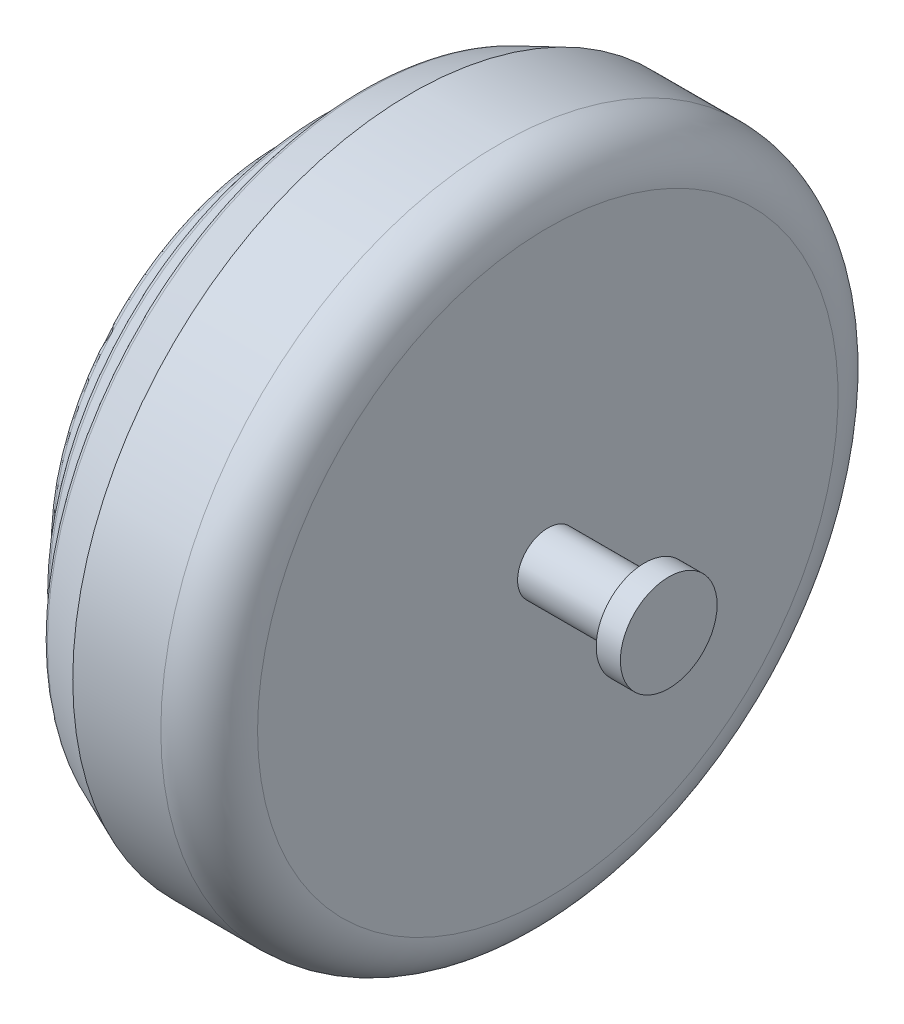
ISO-10303-21;
HEADER;
FILE_DESCRIPTION(('STEP AP214'),'2;1');
FILE_NAME('part.step','',(''),(''),'','','');
FILE_SCHEMA(('AUTOMOTIVE_DESIGN { 1 0 10303 214 1 1 1 1 }'));
ENDSEC;
DATA;
#1=APPLICATION_CONTEXT('core data for automotive mechanical design processes');
#2=APPLICATION_PROTOCOL_DEFINITION('international standard','automotive_design',2000,#1);
#3=PRODUCT_CONTEXT('',#1,'mechanical');
#4=PRODUCT('Part','Part','',(#3));
#5=PRODUCT_RELATED_PRODUCT_CATEGORY('part','',(#4));
#6=PRODUCT_DEFINITION_FORMATION('','',#4);
#7=PRODUCT_DEFINITION_CONTEXT('part definition',#1,'design');
#8=PRODUCT_DEFINITION('design','',#6,#7);
#9=PRODUCT_DEFINITION_SHAPE('','',#8);
#10=(LENGTH_UNIT() NAMED_UNIT(*) SI_UNIT(.MILLI.,.METRE.));
#11=(NAMED_UNIT(*) PLANE_ANGLE_UNIT() SI_UNIT($,.RADIAN.));
#12=(NAMED_UNIT(*) SI_UNIT($,.STERADIAN.) SOLID_ANGLE_UNIT());
#13=UNCERTAINTY_MEASURE_WITH_UNIT(LENGTH_MEASURE(1.E-05),#10,'distance_accuracy_value','');
#14=(GEOMETRIC_REPRESENTATION_CONTEXT(3) GLOBAL_UNCERTAINTY_ASSIGNED_CONTEXT((#13)) GLOBAL_UNIT_ASSIGNED_CONTEXT((#10,
#11,#12)) REPRESENTATION_CONTEXT('',''));
#15=CARTESIAN_POINT('',(0.,0.,0.));
#16=DIRECTION('',(0.,0.,1.));
#17=DIRECTION('',(1.,0.,0.));
#18=AXIS2_PLACEMENT_3D('',#15,#16,#17);
#19=CARTESIAN_POINT('',(126.445710742998,0.,0.));
#20=DIRECTION('',(1.,0.,0.));
#21=DIRECTION('',(0.,0.,-1.));
#22=AXIS2_PLACEMENT_3D('',#19,#20,#21);
#23=PLANE('',#22);
#24=CARTESIAN_POINT('',(126.445710742998,0.,0.));
#25=DIRECTION('',(1.,0.,0.));
#26=DIRECTION('',(0.,0.,-1.));
#27=AXIS2_PLACEMENT_3D('',#24,#25,#26);
#28=CIRCLE('',#27,12.5);
#29=CARTESIAN_POINT('',(126.445710742998,0.,-12.5));
#30=VERTEX_POINT('',#29);
#31=EDGE_CURVE('E99',#30,#30,#28,.T.);
#32=ORIENTED_EDGE('',*,*,#31,.F.);
#33=EDGE_LOOP('',(#32));
#34=FACE_BOUND('',#33,.T.);
#35=CARTESIAN_POINT('',(126.445710742998,0.,0.));
#36=DIRECTION('',(-1.,0.,0.));
#37=DIRECTION('',(0.,0.,1.));
#38=AXIS2_PLACEMENT_3D('',#35,#36,#37);
#39=CIRCLE('',#38,120.);
#40=CARTESIAN_POINT('',(126.445710742998,0.,120.));
#41=VERTEX_POINT('',#40);
#42=EDGE_CURVE('E95',#41,#41,#39,.T.);
#43=ORIENTED_EDGE('',*,*,#42,.F.);
#44=EDGE_LOOP('',(#43));
#45=FACE_BOUND('',#44,.T.);
#46=ADVANCED_FACE('F51',(#34,#45),#23,.T.);
#47=CARTESIAN_POINT('',(106.445710742998,0.,0.));
#48=DIRECTION('',(-1.,0.,0.));
#49=DIRECTION('',(0.,0.,1.));
#50=AXIS2_PLACEMENT_3D('',#47,#48,#49);
#51=TOROIDAL_SURFACE('',#50,120.,20.);
#52=ORIENTED_EDGE('',*,*,#42,.T.);
#53=EDGE_LOOP('',(#52));
#54=FACE_BOUND('',#53,.T.);
#55=CARTESIAN_POINT('',(106.445710742998,0.,0.));
#56=DIRECTION('',(-1.,0.,0.));
#57=DIRECTION('',(0.,0.,1.));
#58=AXIS2_PLACEMENT_3D('',#55,#56,#57);
#59=CIRCLE('',#58,140.);
#60=CARTESIAN_POINT('',(106.445710742998,0.,140.));
#61=VERTEX_POINT('',#60);
#62=EDGE_CURVE('E89',#61,#61,#59,.T.);
#63=ORIENTED_EDGE('',*,*,#62,.F.);
#64=EDGE_LOOP('',(#63));
#65=FACE_BOUND('',#64,.T.);
#66=ADVANCED_FACE('F142',(#54,#65),#51,.T.);
#67=CARTESIAN_POINT('',(15.,0.,0.));
#68=DIRECTION('',(1.,0.,0.));
#69=DIRECTION('',(0.,0.,-1.));
#70=AXIS2_PLACEMENT_3D('',#67,#68,#69);
#71=CONICAL_SURFACE('',#70,95.,0.402417517667305);
#72=CARTESIAN_POINT('',(18.0417805829536,0.,0.));
#73=DIRECTION('',(1.,0.,0.));
#74=DIRECTION('',(0.,0.,-1.));
#75=AXIS2_PLACEMENT_3D('',#72,#73,#74);
#76=CIRCLE('',#75,96.2947211260738);
#77=CARTESIAN_POINT('',(18.0417805829536,0.,-96.2947211260738));
#78=VERTEX_POINT('',#77);
#79=EDGE_CURVE('E80',#78,#78,#76,.T.);
#80=ORIENTED_EDGE('',*,*,#79,.T.);
#81=EDGE_LOOP('',(#80));
#82=FACE_BOUND('',#81,.T.);
#83=CARTESIAN_POINT('',(28.8270288411449,0.,0.));
#84=DIRECTION('',(1.,0.,0.));
#85=DIRECTION('',(0.,0.,-1.));
#86=AXIS2_PLACEMENT_3D('',#83,#84,#85);
#87=CIRCLE('',#86,100.88541673643);
#88=CARTESIAN_POINT('',(28.8270288411449,0.,-100.88541673643));
#89=VERTEX_POINT('',#88);
#90=EDGE_CURVE('E83',#89,#89,#87,.F.);
#91=ORIENTED_EDGE('',*,*,#90,.T.);
#92=EDGE_LOOP('',(#91));
#93=FACE_BOUND('',#92,.T.);
#94=ADVANCED_FACE('F131',(#82,#93),#71,.T.);
#95=CARTESIAN_POINT('',(15.,0.,0.));
#96=DIRECTION('',(1.,0.,0.));
#97=DIRECTION('',(0.,0.,-1.));
#98=AXIS2_PLACEMENT_3D('',#95,#96,#97);
#99=PLANE('',#98);
#100=CARTESIAN_POINT('',(15.,0.,0.));
#101=DIRECTION('',(1.,0.,0.));
#102=DIRECTION('',(0.,0.,-1.));
#103=AXIS2_PLACEMENT_3D('',#100,#101,#102);
#104=CIRCLE('',#103,91.6941367376833);
#105=CARTESIAN_POINT('',(15.,0.,-91.6941367376833));
#106=VERTEX_POINT('',#105);
#107=EDGE_CURVE('E86',#106,#106,#104,.F.);
#108=ORIENTED_EDGE('',*,*,#107,.T.);
#109=EDGE_LOOP('',(#108));
#110=FACE_BOUND('',#109,.T.);
#111=ADVANCED_FACE('F128',(#110),#99,.F.);
#112=CARTESIAN_POINT('',(31.8688094240985,0.,0.));
#113=DIRECTION('',(-1.,0.,0.));
#114=DIRECTION('',(0.,0.,1.));
#115=AXIS2_PLACEMENT_3D('',#112,#113,#114);
#116=PLANE('',#115);
#117=CARTESIAN_POINT('',(31.8688094240985,0.,0.));
#118=DIRECTION('',(-1.,0.,0.));
#119=DIRECTION('',(0.,0.,1.));
#120=AXIS2_PLACEMENT_3D('',#117,#118,#119);
#121=CIRCLE('',#120,105.48600112482);
#122=CARTESIAN_POINT('',(31.8688094240985,0.,105.48600112482));
#123=VERTEX_POINT('',#122);
#124=EDGE_CURVE('E74',#123,#123,#121,.F.);
#125=ORIENTED_EDGE('',*,*,#124,.T.);
#126=EDGE_LOOP('',(#125));
#127=FACE_BOUND('',#126,.T.);
#128=CARTESIAN_POINT('',(31.8688094240985,0.,0.));
#129=DIRECTION('',(-1.,0.,0.));
#130=DIRECTION('',(0.,0.,1.));
#131=AXIS2_PLACEMENT_3D('',#128,#129,#130);
#132=CIRCLE('',#131,110.124274600187);
#133=CARTESIAN_POINT('',(31.8688094240985,0.,110.124274600187));
#134=VERTEX_POINT('',#133);
#135=EDGE_CURVE('E77',#134,#134,#132,.T.);
#136=ORIENTED_EDGE('',*,*,#135,.T.);
#137=EDGE_LOOP('',(#136));
#138=FACE_BOUND('',#137,.T.);
#139=ADVANCED_FACE('F130',(#127,#138),#116,.T.);
#140=CARTESIAN_POINT('',(31.8688094240985,0.,0.));
#141=DIRECTION('',(1.,0.,0.));
#142=DIRECTION('',(0.,0.,-1.));
#143=AXIS2_PLACEMENT_3D('',#140,#141,#142);
#144=CONICAL_SURFACE('',#143,113.430137862503,0.402417517667305);
#145=CARTESIAN_POINT('',(34.9105900070522,0.,0.));
#146=DIRECTION('',(-1.,0.,0.));
#147=DIRECTION('',(0.,0.,1.));
#148=AXIS2_PLACEMENT_3D('',#145,#146,#147);
#149=CIRCLE('',#148,114.724858988577);
#150=CARTESIAN_POINT('',(34.9105900070522,0.,114.724858988577));
#151=VERTEX_POINT('',#150);
#152=EDGE_CURVE('E66',#151,#151,#149,.F.);
#153=ORIENTED_EDGE('',*,*,#152,.T.);
#154=EDGE_LOOP('',(#153));
#155=FACE_BOUND('',#154,.T.);
#156=CARTESIAN_POINT('',(45.6958382652435,0.,0.));
#157=DIRECTION('',(1.,0.,0.));
#158=DIRECTION('',(0.,0.,-1.));
#159=AXIS2_PLACEMENT_3D('',#156,#157,#158);
#160=CIRCLE('',#159,119.315554598933);
#161=CARTESIAN_POINT('',(45.6958382652435,0.,-119.315554598933));
#162=VERTEX_POINT('',#161);
#163=EDGE_CURVE('E71',#162,#162,#160,.F.);
#164=ORIENTED_EDGE('',*,*,#163,.T.);
#165=EDGE_LOOP('',(#164));
#166=FACE_BOUND('',#165,.T.);
#167=ADVANCED_FACE('F138',(#155,#166),#144,.T.);
#168=CARTESIAN_POINT('',(48.737618848197,0.,0.));
#169=DIRECTION('',(-1.,0.,0.));
#170=DIRECTION('',(0.,0.,1.));
#171=AXIS2_PLACEMENT_3D('',#168,#169,#170);
#172=PLANE('',#171);
#173=CARTESIAN_POINT('',(48.737618848197,0.,0.));
#174=DIRECTION('',(-1.,0.,0.));
#175=DIRECTION('',(0.,0.,1.));
#176=AXIS2_PLACEMENT_3D('',#173,#174,#175);
#177=CIRCLE('',#176,123.916138987324);
#178=CARTESIAN_POINT('',(48.737618848197,0.,123.916138987324));
#179=VERTEX_POINT('',#178);
#180=EDGE_CURVE('E58',#179,#179,#177,.F.);
#181=ORIENTED_EDGE('',*,*,#180,.T.);
#182=EDGE_LOOP('',(#181));
#183=FACE_BOUND('',#182,.T.);
#184=CARTESIAN_POINT('',(48.737618848197,0.,0.));
#185=DIRECTION('',(-1.,0.,0.));
#186=DIRECTION('',(0.,0.,1.));
#187=AXIS2_PLACEMENT_3D('',#184,#185,#186);
#188=CIRCLE('',#187,127.626890523058);
#189=CARTESIAN_POINT('',(48.737618848197,0.,127.626890523058));
#190=VERTEX_POINT('',#189);
#191=EDGE_CURVE('E62',#190,#190,#188,.T.);
#192=ORIENTED_EDGE('',*,*,#191,.T.);
#193=EDGE_LOOP('',(#192));
#194=FACE_BOUND('',#193,.T.);
#195=ADVANCED_FACE('F150',(#183,#194),#172,.T.);
#196=CARTESIAN_POINT('',(48.7376188481971,0.,0.));
#197=DIRECTION('',(1.,0.,0.));
#198=DIRECTION('',(0.,0.,-1.));
#199=AXIS2_PLACEMENT_3D('',#196,#197,#198);
#200=CONICAL_SURFACE('',#199,130.932753785375,0.402417517667306);
#201=CARTESIAN_POINT('',(51.7793994311506,0.,0.));
#202=DIRECTION('',(-1.,0.,0.));
#203=DIRECTION('',(0.,0.,1.));
#204=AXIS2_PLACEMENT_3D('',#201,#202,#203);
#205=CIRCLE('',#204,132.227474911449);
#206=CARTESIAN_POINT('',(51.7793994311506,0.,132.227474911449));
#207=VERTEX_POINT('',#206);
#208=EDGE_CURVE('E10',#207,#207,#205,.F.);
#209=ORIENTED_EDGE('',*,*,#208,.T.);
#210=EDGE_LOOP('',(#209));
#211=FACE_BOUND('',#210,.T.);
#212=CARTESIAN_POINT('',(70.0399463696018,0.,0.));
#213=DIRECTION('',(-1.,0.,0.));
#214=DIRECTION('',(0.,0.,1.));
#215=AXIS2_PLACEMENT_3D('',#212,#213,#214);
#216=CIRCLE('',#215,140.);
#217=CARTESIAN_POINT('',(70.0399463696018,0.,140.));
#218=VERTEX_POINT('',#217);
#219=EDGE_CURVE('E92',#218,#218,#216,.T.);
#220=ORIENTED_EDGE('',*,*,#219,.T.);
#221=EDGE_LOOP('',(#220));
#222=FACE_BOUND('',#221,.T.);
#223=ADVANCED_FACE('F154',(#211,#222),#200,.T.);
#224=CARTESIAN_POINT('',(-209.218950064021,0.,0.));
#225=DIRECTION('',(-1.,0.,0.));
#226=DIRECTION('',(0.,0.,1.));
#227=AXIS2_PLACEMENT_3D('',#224,#225,#226);
#228=CYLINDRICAL_SURFACE('',#227,140.);
#229=ORIENTED_EDGE('',*,*,#62,.T.);
#230=EDGE_LOOP('',(#229));
#231=FACE_BOUND('',#230,.T.);
#232=ORIENTED_EDGE('',*,*,#219,.F.);
#233=EDGE_LOOP('',(#232));
#234=FACE_BOUND('',#233,.T.);
#235=ADVANCED_FACE('F156',(#231,#234),#228,.T.);
#236=CARTESIAN_POINT('',(20.,0.,0.));
#237=DIRECTION('',(1.,0.,0.));
#238=DIRECTION('',(0.,0.,-1.));
#239=AXIS2_PLACEMENT_3D('',#236,#237,#238);
#240=TOROIDAL_SURFACE('',#239,91.6941367376833,5.);
#241=ORIENTED_EDGE('',*,*,#79,.F.);
#242=EDGE_LOOP('',(#241));
#243=FACE_BOUND('',#242,.T.);
#244=ORIENTED_EDGE('',*,*,#107,.F.);
#245=EDGE_LOOP('',(#244));
#246=FACE_BOUND('',#245,.T.);
#247=ADVANCED_FACE('F159',(#243,#246),#240,.T.);
#248=CARTESIAN_POINT('',(26.8688094240985,0.,0.));
#249=DIRECTION('',(-1.,0.,0.));
#250=DIRECTION('',(0.,0.,1.));
#251=AXIS2_PLACEMENT_3D('',#248,#249,#250);
#252=TOROIDAL_SURFACE('',#251,105.48600112482,5.);
#253=ORIENTED_EDGE('',*,*,#124,.F.);
#254=EDGE_LOOP('',(#253));
#255=FACE_BOUND('',#254,.T.);
#256=ORIENTED_EDGE('',*,*,#90,.F.);
#257=EDGE_LOOP('',(#256));
#258=FACE_BOUND('',#257,.T.);
#259=ADVANCED_FACE('F166',(#255,#258),#252,.F.);
#260=CARTESIAN_POINT('',(36.8688094240985,0.,0.));
#261=DIRECTION('',(-1.,0.,0.));
#262=DIRECTION('',(0.,0.,1.));
#263=AXIS2_PLACEMENT_3D('',#260,#261,#262);
#264=TOROIDAL_SURFACE('',#263,110.124274600187,5.);
#265=ORIENTED_EDGE('',*,*,#152,.F.);
#266=EDGE_LOOP('',(#265));
#267=FACE_BOUND('',#266,.T.);
#268=ORIENTED_EDGE('',*,*,#135,.F.);
#269=EDGE_LOOP('',(#268));
#270=FACE_BOUND('',#269,.T.);
#271=ADVANCED_FACE('F170',(#267,#270),#264,.T.);
#272=CARTESIAN_POINT('',(43.737618848197,0.,0.));
#273=DIRECTION('',(-1.,0.,0.));
#274=DIRECTION('',(0.,0.,1.));
#275=AXIS2_PLACEMENT_3D('',#272,#273,#274);
#276=TOROIDAL_SURFACE('',#275,123.916138987324,5.);
#277=ORIENTED_EDGE('',*,*,#180,.F.);
#278=EDGE_LOOP('',(#277));
#279=FACE_BOUND('',#278,.T.);
#280=ORIENTED_EDGE('',*,*,#163,.F.);
#281=EDGE_LOOP('',(#280));
#282=FACE_BOUND('',#281,.T.);
#283=ADVANCED_FACE('F173',(#279,#282),#276,.F.);
#284=CARTESIAN_POINT('',(53.737618848197,0.,0.));
#285=DIRECTION('',(-1.,0.,0.));
#286=DIRECTION('',(0.,0.,1.));
#287=AXIS2_PLACEMENT_3D('',#284,#285,#286);
#288=TOROIDAL_SURFACE('',#287,127.626890523058,5.);
#289=ORIENTED_EDGE('',*,*,#208,.F.);
#290=EDGE_LOOP('',(#289));
#291=FACE_BOUND('',#290,.T.);
#292=ORIENTED_EDGE('',*,*,#191,.F.);
#293=EDGE_LOOP('',(#292));
#294=FACE_BOUND('',#293,.T.);
#295=ADVANCED_FACE('F53',(#291,#294),#288,.T.);
#296=CARTESIAN_POINT('',(166.445710742998,0.,0.));
#297=DIRECTION('',(-1.,0.,0.));
#298=DIRECTION('',(0.,0.,1.));
#299=AXIS2_PLACEMENT_3D('',#296,#297,#298);
#300=CYLINDRICAL_SURFACE('',#299,12.5);
#301=CARTESIAN_POINT('',(166.445710742998,0.,0.));
#302=DIRECTION('',(1.,0.,0.));
#303=DIRECTION('',(0.,0.,-1.));
#304=AXIS2_PLACEMENT_3D('',#301,#302,#303);
#305=CIRCLE('',#304,12.5);
#306=CARTESIAN_POINT('',(166.445710742998,0.,-12.5));
#307=VERTEX_POINT('',#306);
#308=EDGE_CURVE('E98',#307,#307,#305,.T.);
#309=ORIENTED_EDGE('',*,*,#308,.F.);
#310=EDGE_LOOP('',(#309));
#311=FACE_BOUND('',#310,.T.);
#312=ORIENTED_EDGE('',*,*,#31,.T.);
#313=EDGE_LOOP('',(#312));
#314=FACE_BOUND('',#313,.T.);
#315=ADVANCED_FACE('F116',(#311,#314),#300,.T.);
#316=CARTESIAN_POINT('',(176.445710742998,0.,0.));
#317=DIRECTION('',(-1.,0.,0.));
#318=DIRECTION('',(0.,0.,1.));
#319=AXIS2_PLACEMENT_3D('',#316,#317,#318);
#320=CYLINDRICAL_SURFACE('',#319,20.);
#321=CARTESIAN_POINT('',(176.445710742998,0.,0.));
#322=DIRECTION('',(1.,0.,0.));
#323=DIRECTION('',(0.,0.,-1.));
#324=AXIS2_PLACEMENT_3D('',#321,#322,#323);
#325=CIRCLE('',#324,20.);
#326=CARTESIAN_POINT('',(176.445710742998,0.,-20.));
#327=VERTEX_POINT('',#326);
#328=EDGE_CURVE('E102',#327,#327,#325,.T.);
#329=ORIENTED_EDGE('',*,*,#328,.F.);
#330=EDGE_LOOP('',(#329));
#331=FACE_BOUND('',#330,.T.);
#332=CARTESIAN_POINT('',(166.445710742998,0.,0.));
#333=DIRECTION('',(1.,0.,0.));
#334=DIRECTION('',(0.,0.,-1.));
#335=AXIS2_PLACEMENT_3D('',#332,#333,#334);
#336=CIRCLE('',#335,20.);
#337=CARTESIAN_POINT('',(166.445710742998,0.,-20.));
#338=VERTEX_POINT('',#337);
#339=EDGE_CURVE('E105',#338,#338,#336,.T.);
#340=ORIENTED_EDGE('',*,*,#339,.T.);
#341=EDGE_LOOP('',(#340));
#342=FACE_BOUND('',#341,.T.);
#343=ADVANCED_FACE('F113',(#331,#342),#320,.T.);
#344=CARTESIAN_POINT('',(176.445710742998,0.,0.));
#345=DIRECTION('',(1.,0.,0.));
#346=DIRECTION('',(0.,0.,-1.));
#347=AXIS2_PLACEMENT_3D('',#344,#345,#346);
#348=PLANE('',#347);
#349=ORIENTED_EDGE('',*,*,#328,.T.);
#350=EDGE_LOOP('',(#349));
#351=FACE_BOUND('',#350,.T.);
#352=ADVANCED_FACE('F111',(#351),#348,.T.);
#353=CARTESIAN_POINT('',(166.445710742998,0.,0.));
#354=DIRECTION('',(1.,0.,0.));
#355=DIRECTION('',(0.,0.,-1.));
#356=AXIS2_PLACEMENT_3D('',#353,#354,#355);
#357=PLANE('',#356);
#358=ORIENTED_EDGE('',*,*,#308,.T.);
#359=EDGE_LOOP('',(#358));
#360=FACE_BOUND('',#359,.T.);
#361=ORIENTED_EDGE('',*,*,#339,.F.);
#362=EDGE_LOOP('',(#361));
#363=FACE_BOUND('',#362,.T.);
#364=ADVANCED_FACE('F120',(#360,#363),#357,.F.);
#365=CLOSED_SHELL('',(#46,#66,#94,#111,#139,#167,#195,#223,#235,#247,#259,#271,#283,#295,#315,
#343,#352,#364));
#366=MANIFOLD_SOLID_BREP('B2',#365);
#367=ADVANCED_BREP_SHAPE_REPRESENTATION('',(#18,#366),#14);
#368=SHAPE_DEFINITION_REPRESENTATION(#9,#367);
ENDSEC;
END-ISO-10303-21;
